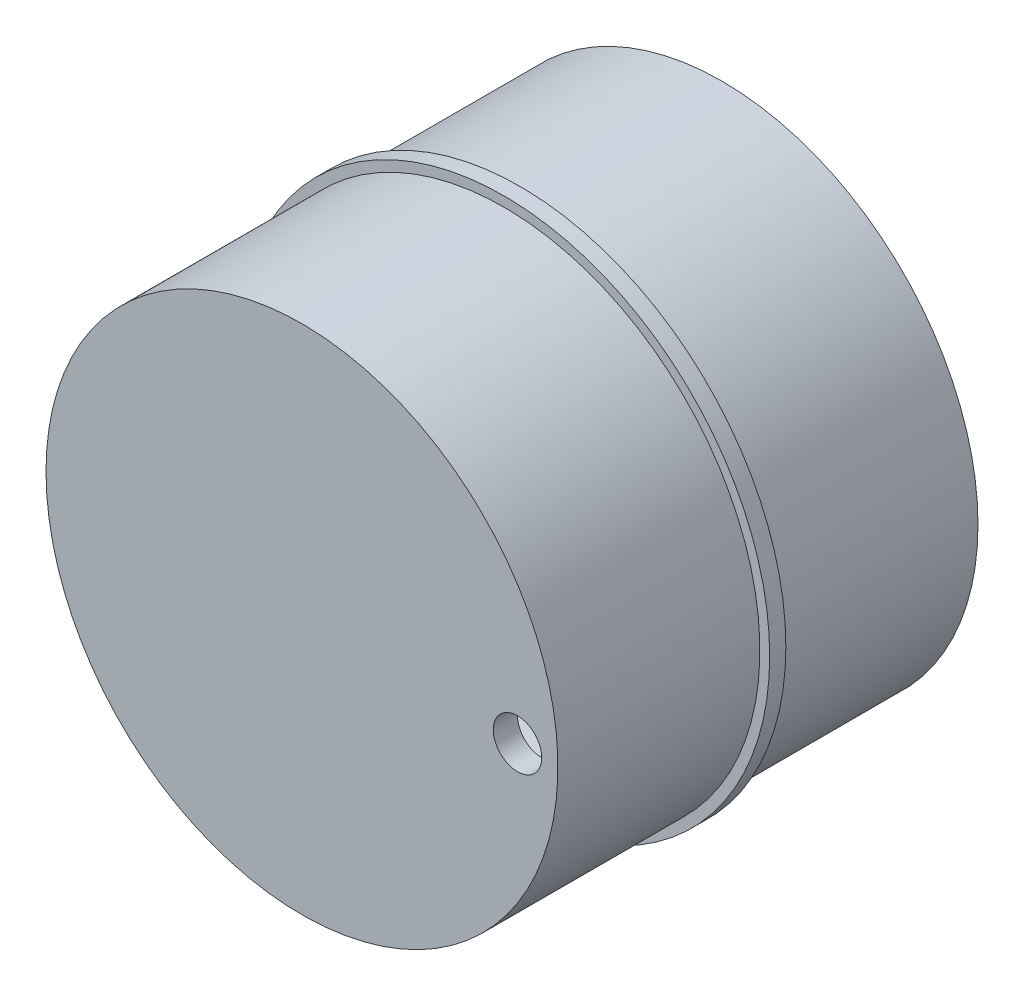
ISO-10303-21;
HEADER;
FILE_DESCRIPTION(('STEP AP214'),'2;1');
FILE_NAME('part.step','',(''),(''),'','','');
FILE_SCHEMA(('AUTOMOTIVE_DESIGN { 1 0 10303 214 1 1 1 1 }'));
ENDSEC;
DATA;
#1=APPLICATION_CONTEXT('core data for automotive mechanical design processes');
#2=APPLICATION_PROTOCOL_DEFINITION('international standard','automotive_design',2000,#1);
#3=PRODUCT_CONTEXT('',#1,'mechanical');
#4=PRODUCT('Part','Part','',(#3));
#5=PRODUCT_RELATED_PRODUCT_CATEGORY('part','',(#4));
#6=PRODUCT_DEFINITION_FORMATION('','',#4);
#7=PRODUCT_DEFINITION_CONTEXT('part definition',#1,'design');
#8=PRODUCT_DEFINITION('design','',#6,#7);
#9=PRODUCT_DEFINITION_SHAPE('','',#8);
#10=(LENGTH_UNIT() NAMED_UNIT(*) SI_UNIT(.MILLI.,.METRE.));
#11=(NAMED_UNIT(*) PLANE_ANGLE_UNIT() SI_UNIT($,.RADIAN.));
#12=(NAMED_UNIT(*) SI_UNIT($,.STERADIAN.) SOLID_ANGLE_UNIT());
#13=UNCERTAINTY_MEASURE_WITH_UNIT(LENGTH_MEASURE(1.E-05),#10,'distance_accuracy_value','');
#14=(GEOMETRIC_REPRESENTATION_CONTEXT(3) GLOBAL_UNCERTAINTY_ASSIGNED_CONTEXT((#13)) GLOBAL_UNIT_ASSIGNED_CONTEXT((#10,
#11,#12)) REPRESENTATION_CONTEXT('',''));
#15=CARTESIAN_POINT('',(0.,0.,0.));
#16=DIRECTION('',(0.,0.,1.));
#17=DIRECTION('',(1.,0.,0.));
#18=AXIS2_PLACEMENT_3D('',#15,#16,#17);
#19=CARTESIAN_POINT('',(0.,0.,26.));
#20=DIRECTION('',(0.,0.,-1.));
#21=DIRECTION('',(-1.,0.,0.));
#22=AXIS2_PLACEMENT_3D('',#19,#20,#21);
#23=CYLINDRICAL_SURFACE('',#22,29.685);
#24=CARTESIAN_POINT('',(0.,0.,-24.));
#25=DIRECTION('',(0.,0.,1.));
#26=DIRECTION('',(1.,0.,0.));
#27=AXIS2_PLACEMENT_3D('',#24,#25,#26);
#28=CIRCLE('',#27,29.685);
#29=CARTESIAN_POINT('',(29.685,0.,-24.));
#30=VERTEX_POINT('',#29);
#31=EDGE_CURVE('E48',#30,#30,#28,.F.);
#32=ORIENTED_EDGE('',*,*,#31,.T.);
#33=EDGE_LOOP('',(#32));
#34=FACE_BOUND('',#33,.T.);
#35=CARTESIAN_POINT('',(29.453969537057,-3.69633649849684,21.0730076943461));
#36=CARTESIAN_POINT('',(29.5229392700678,-3.14675655199982,23.193965750302));
#37=CARTESIAN_POINT('',(27.3507169139899,-2.92520443566389,23.));
#38=CARTESIAN_POINT('',(29.4695717528673,-3.57224783006701,21.042455111234));
#39=CARTESIAN_POINT('',(29.5205826106953,-3.14657390087494,23.1578681699926));
#40=CARTESIAN_POINT('',(27.3837056706705,-2.91761885504985,23.));
#41=CARTESIAN_POINT('',(29.4846512945967,-3.44551478342881,21.0216481388088));
#42=CARTESIAN_POINT('',(29.5199609112697,-3.13905360424794,23.1180814910689));
#43=CARTESIAN_POINT('',(27.4196863234798,-2.90891495812056,23.));
#44=CARTESIAN_POINT('',(29.5133284281869,-3.19039451794967,20.9989874823953));
#45=CARTESIAN_POINT('',(29.5218572889417,-3.10725035716894,23.0355135884787));
#46=CARTESIAN_POINT('',(27.4986435155833,-2.8878663753083,23.));
#47=CARTESIAN_POINT('',(29.5269311746504,-3.06201492466677,20.9970656306401));
#48=CARTESIAN_POINT('',(29.5243001985303,-3.08339422801461,22.9928991113845));
#49=CARTESIAN_POINT('',(27.5415943240499,-2.87553494956119,23.));
#50=CARTESIAN_POINT('',(29.5531535138343,-2.79806859462038,21.0118871211079));
#51=CARTESIAN_POINT('',(29.5320485476803,-3.01585794925101,22.9055103637982));
#52=CARTESIAN_POINT('',(27.638753504253,-2.84483640287777,23.));
#53=CARTESIAN_POINT('',(29.5656535585365,-2.66257081859773,21.0298392096289));
#54=CARTESIAN_POINT('',(29.5374573576492,-2.97148899039025,22.8608171563369));
#55=CARTESIAN_POINT('',(27.6935083481125,-2.82613202304417,23.));
#56=CARTESIAN_POINT('',(29.5884644320832,-2.39581081130452,21.0848958316496));
#57=CARTESIAN_POINT('',(29.5503446439766,-2.86188730247467,22.7763696584035));
#58=CARTESIAN_POINT('',(27.8140102273393,-2.7802049658591,23.));
#59=CARTESIAN_POINT('',(29.598772919087,-2.26455323670954,21.1220207089128));
#60=CARTESIAN_POINT('',(29.5577538578129,-2.79732120062838,22.7366292535912));
#61=CARTESIAN_POINT('',(27.8797688883795,-2.75297325247506,23.));
#62=CARTESIAN_POINT('',(29.6130424859975,-2.06685662812519,21.1926681751423));
#63=CARTESIAN_POINT('',(29.5701138737769,-2.68076175453047,22.6820314595268));
#64=CARTESIAN_POINT('',(27.9909740784887,-2.70116428411568,23.));
#65=CARTESIAN_POINT('',(29.6177664973162,-1.99793663142989,21.220233920248));
#66=CARTESIAN_POINT('',(29.5746069554554,-2.6368635376191,22.6642020636993));
#67=CARTESIAN_POINT('',(28.0321665193155,-2.68095099448803,23.));
#68=CARTESIAN_POINT('',(29.6265947067415,-1.86244748444681,21.280103005163));
#69=CARTESIAN_POINT('',(29.5837434498484,-2.5431389934535,22.6319808348061));
#70=CARTESIAN_POINT('',(28.1183492275346,-2.6358837953534,23.));
#71=CARTESIAN_POINT('',(29.6306988709957,-1.79587846270731,21.312406603536));
#72=CARTESIAN_POINT('',(29.5883800195555,-2.49345097845629,22.6175515151894));
#73=CARTESIAN_POINT('',(28.1633397021439,-2.6110296325552,23.));
#74=CARTESIAN_POINT('',(29.6383205171549,-1.66536997735267,21.3813148936457));
#75=CARTESIAN_POINT('',(29.5976497151315,-2.38843809834289,22.5927304467358));
#76=CARTESIAN_POINT('',(28.2570652075544,-2.5556936896706,23.));
#77=CARTESIAN_POINT('',(29.6418382619637,-1.60142934511592,21.4179176453698));
#78=CARTESIAN_POINT('',(29.6022786034926,-2.33325530151748,22.582283284738));
#79=CARTESIAN_POINT('',(28.3057985459612,-2.52521444440798,23.));
#80=CARTESIAN_POINT('',(29.6483351237785,-1.47627107705529,21.4950062933113));
#81=CARTESIAN_POINT('',(29.6113992004423,-2.21758405950222,22.5659109167429));
#82=CARTESIAN_POINT('',(28.4067976515099,-2.45746060629176,23.));
#83=CARTESIAN_POINT('',(29.6513142091812,-1.41505360115885,21.5354924171546));
#84=CARTESIAN_POINT('',(29.6158896624329,-2.15722770372803,22.5599173811097));
#85=CARTESIAN_POINT('',(28.4590636256659,-2.42018561498649,23.));
#86=CARTESIAN_POINT('',(29.6564334620038,-1.30303846152774,21.6145102476505));
#87=CARTESIAN_POINT('',(29.6240664928161,-2.03956267983707,22.5532630062374));
#88=CARTESIAN_POINT('',(28.5597072143441,-2.34285411877155,23.));
#89=CARTESIAN_POINT('',(29.6586321788916,-1.25190850905339,21.6526312659524));
#90=CARTESIAN_POINT('',(29.6277759049516,-1.98304343273738,22.5519680981928));
#91=CARTESIAN_POINT('',(28.6077290013196,-2.30376073833534,23.));
#92=CARTESIAN_POINT('',(29.6626914621364,-1.15172654572012,21.7312030077597));
#93=CARTESIAN_POINT('',(29.6349360385304,-1.86666988893333,22.5532271240883));
#94=CARTESIAN_POINT('',(28.7054344205754,-2.21856855400212,23.));
#95=CARTESIAN_POINT('',(29.6645519761297,-1.10267485753832,21.7716540907537));
#96=CARTESIAN_POINT('',(29.638389789997,-1.80687575580797,22.5557250780581));
#97=CARTESIAN_POINT('',(28.7551183087907,-2.17246866731539,23.));
#98=CARTESIAN_POINT('',(29.6679689557636,-1.00655719886465,21.8546160996372));
#99=CARTESIAN_POINT('',(29.644987204302,-1.68431008998295,22.564604933006));
#100=CARTESIAN_POINT('',(28.8552792765414,-2.07241393618785,23.));
#101=CARTESIAN_POINT('',(29.669525236535,-0.959492449282768,21.8971282584956));
#102=CARTESIAN_POINT('',(29.6481354099169,-1.62157503795497,22.5709334480841));
#103=CARTESIAN_POINT('',(28.9057568183442,-2.01845435028241,23.));
#104=CARTESIAN_POINT('',(29.672364434785,-0.867261567238716,21.9839067108727));
#105=CARTESIAN_POINT('',(29.6540787972586,-1.49357303590975,22.5873878405427));
#106=CARTESIAN_POINT('',(29.006266061795,-1.90200839747366,23.));
#107=CARTESIAN_POINT('',(29.6736473628078,-0.822095361597305,22.028172936653));
#108=CARTESIAN_POINT('',(29.6568800360234,-1.42831694681504,22.5974639134312));
#109=CARTESIAN_POINT('',(29.0562977805684,-1.83952235961676,23.));
#110=CARTESIAN_POINT('',(29.67597275951,-0.733376062804029,22.1183121246014));
#111=CARTESIAN_POINT('',(29.6621074427791,-1.29551313585051,22.6212330712191));
#112=CARTESIAN_POINT('',(29.1545262838625,-1.70539264692542,23.));
#113=CARTESIAN_POINT('',(29.6770145654228,-0.68982768565854,22.1641891253177));
#114=CARTESIAN_POINT('',(29.6645396770828,-1.22793467005463,22.6348981879123));
#115=CARTESIAN_POINT('',(29.2027177138018,-1.63372455321324,23.));
#116=CARTESIAN_POINT('',(29.6788799430094,-0.604269336932527,22.2571749730407));
#117=CARTESIAN_POINT('',(29.6690005013195,-1.09107218663939,22.6654961259292));
#118=CARTESIAN_POINT('',(29.2953091080832,-1.48129405248241,23.));
#119=CARTESIAN_POINT('',(29.6797035113215,-0.562259389057998,22.3042838390103));
#120=CARTESIAN_POINT('',(29.6710365032522,-1.02172845966825,22.6824079420012));
#121=CARTESIAN_POINT('',(29.339709014015,-1.40053150540341,23.));
#122=CARTESIAN_POINT('',(29.6811550850932,-0.479549948851121,22.3994731960801));
#123=CARTESIAN_POINT('',(29.6746929849381,-0.881758664985384,22.7190422964511));
#124=CARTESIAN_POINT('',(29.4227230305448,-1.23037644579445,23.));
#125=CARTESIAN_POINT('',(29.6817831341938,-0.438850165902445,22.4475534678011));
#126=CARTESIAN_POINT('',(29.6763207574181,-0.811035362955835,22.7387640865103));
#127=CARTESIAN_POINT('',(29.4613384312823,-1.14098586494211,23.));
#128=CARTESIAN_POINT('',(29.6828625368063,-0.358485620701307,22.5444586092211));
#129=CARTESIAN_POINT('',(29.6791558990851,-0.668674967542147,22.7804696361572));
#130=CARTESIAN_POINT('',(29.5308053907974,-0.954604468150846,23.));
#131=CARTESIAN_POINT('',(29.6833138923945,-0.318820846290988,22.593283470163));
#132=CARTESIAN_POINT('',(29.6803696471459,-0.596904142807643,22.8024756790611));
#133=CARTESIAN_POINT('',(29.5616570408096,-0.857613741541609,23.));
#134=CARTESIAN_POINT('',(29.683902257893,-0.256337336398953,22.6713395217971));
#135=CARTESIAN_POINT('',(29.6819666897835,-0.482182649062376,22.8388108560275));
#136=CARTESIAN_POINT('',(29.6031474901909,-0.698670618629292,23.));
#137=CARTESIAN_POINT('',(29.6840922908404,-0.23327538004457,22.7004018651535));
#138=CARTESIAN_POINT('',(29.6824866763772,-0.439514147662455,22.8525752252461));
#139=CARTESIAN_POINT('',(29.6168886900754,-0.638645314309743,23.));
#140=CARTESIAN_POINT('',(29.6844176570562,-0.187351017765726,22.7586599082789));
#141=CARTESIAN_POINT('',(29.6833807201375,-0.354032242761675,22.8805352935781));
#142=CARTESIAN_POINT('',(29.640769703198,-0.516983797238154,23.));
#143=CARTESIAN_POINT('',(29.6845529948504,-0.164488595484086,22.7878555968122));
#144=CARTESIAN_POINT('',(29.6837555900819,-0.311182271628054,22.8947418329877));
#145=CARTESIAN_POINT('',(29.650909814399,-0.455347718218853,23.));
#146=CARTESIAN_POINT('',(29.6848792865771,-0.0961479727651823,22.875521716882));
#147=CARTESIAN_POINT('',(29.6846597207476,-0.18271240410829,22.9377290214179));
#148=CARTESIAN_POINT('',(29.6755476386697,-0.26886486865931,23.));
#149=CARTESIAN_POINT('',(29.684990942448,-0.0508709317983721,22.9341285104842));
#150=CARTESIAN_POINT('',(29.6849745669356,-0.0966062436314608,22.9670630048246));
#151=CARTESIAN_POINT('',(29.6842942040959,-0.14232527764074,23.));
#152=CARTESIAN_POINT('',(29.684999822859,-0.00373661662785953,22.995161481673));
#153=CARTESIAN_POINT('',(29.6849995080726,-0.00709561682999533,22.9975807304717));
#154=CARTESIAN_POINT('',(29.6849864531754,-0.0104546029644848,23.));
#155=CARTESIAN_POINT('',(29.6849999991784,-0.00186830794603105,22.9975807410863));
#156=CARTESIAN_POINT('',(29.6850000016923,-0.00354779290526891,22.998790363653));
#157=CARTESIAN_POINT('',(29.6850001249004,-0.00522728704639961,23.));
#158=CARTESIAN_POINT('',(29.685,0.,23.));
#159=CARTESIAN_POINT('',(29.685,2.72241405150234E-08,23.));
#160=CARTESIAN_POINT('',(29.685,5.44482810300468E-08,23.));
#161=(BOUNDED_SURFACE() B_SPLINE_SURFACE(3,2,((#35,#36,#37),(#38,#39,#40),(#41,#42,#43),(#44,
#45,#46),(#47,#48,#49),(#50,#51,#52),(#53,#54,#55),(#56,#57,#58),(#59,#60,#61),(#62,#63,#64),
(#65,#66,#67),(#68,#69,#70),(#71,#72,#73),(#74,#75,#76),(#77,#78,#79),(#80,#81,#82),(#83,#84,
#85),(#86,#87,#88),(#89,#90,#91),(#92,#93,#94),(#95,#96,#97),(#98,#99,#100),(#101,#102,#103),
(#104,#105,#106),(#107,#108,#109),(#110,#111,#112),(#113,#114,#115),(#116,#117,#118),(#119,#120,
#121),(#122,#123,#124),(#125,#126,#127),(#128,#129,#130),(#131,#132,#133),(#134,#135,#136),
(#137,#138,#139),(#140,#141,#142),(#143,#144,#145),(#146,#147,#148),(#149,#150,#151),(#152,#153,
#154),(#155,#156,#157),(#158,#159,#160)),.UNSPECIFIED.,.F.,.F.,
.F.) B_SPLINE_SURFACE_WITH_KNOTS((4,2,2,2,2,2,2,2,2,2,2,2,2,2,2,2,2,2,2,2,4),(3,3),(0.,
0.361081568538373,0.720859295513028,1.10378268553387,1.48711322327682,1.69717429873617,
1.90724684233589,2.11722495133578,2.32721537584145,2.51038880958023,2.69359057989006,
2.87690333029894,3.06020900843962,3.24401270431783,3.42781923127684,3.61158470195191,
3.79534801303014,3.90381520162624,4.01227341328839,4.22897594531716,4.2379202172408),(0.,1.),
.UNSPECIFIED.) GEOMETRIC_REPRESENTATION_ITEM() RATIONAL_B_SPLINE_SURFACE(((1.,0.673998534827001,
1.),(1.,0.680289928360832,1.),(1.,0.686911742011523,1.),(1.,0.700914381981028,1.),(1.,
0.708292381214728,1.),(1.,0.724452859527103,1.),(1.,0.733295157529229,1.),(1.,0.752192426877243,
1.),(1.,0.762248677615647,1.),(1.,0.778826443155952,1.),(1.,0.784891067513485,1.),(1.,
0.797417966880452,1.),(1.,0.803880263581275,1.),(1.,0.817177906274684,1.),(1.,0.824013083263296,
1.),(1.,0.838009947839924,1.),(1.,0.845171654554724,1.),(1.,0.858801285198915,1.),(1.,
0.865241010600349,1.),(1.,0.878212891758965,1.),(1.,0.88474506166083,1.),(1.,0.897786402088374,
1.),(1.,0.904295556284363,1.),(1.,0.917136776856061,1.),(1.,0.92346885005419,1.),(1.,
0.935794111618746,1.),(1.,0.941786332539605,1.),(1.,0.953210638277745,1.),(1.,0.958642714465972,
1.),(1.,0.968732531765465,1.),(1.,0.973390445566492,1.),(1.,0.98172684395136,1.),(1.,
0.98540534004473,1.),(1.,0.990334930860917,1.),(1.,0.991963054820812,1.),(1.,0.994787885445139,
1.),(1.,0.995984627803268,1.),(1.,0.998889860818611,1.),(1.,0.999917063749642,1.),(1.,
0.999998404885635,1.),(1.,1.00000001227378,1.),(1.,1.,1.))) REPRESENTATION_ITEM('') SURFACE());
#162=CARTESIAN_POINT('',(29.453969537057,-3.69633649849684,21.0730076943461));
#163=CARTESIAN_POINT('',(29.4695717528673,-3.57224783006701,21.042455111234));
#164=CARTESIAN_POINT('',(29.4846512945967,-3.44551478342881,21.0216481388088));
#165=CARTESIAN_POINT('',(29.5133284281869,-3.19039451794967,20.9989874823953));
#166=CARTESIAN_POINT('',(29.5269311746504,-3.06201492466677,20.9970656306401));
#167=CARTESIAN_POINT('',(29.5531535138343,-2.79806859462038,21.0118871211079));
#168=CARTESIAN_POINT('',(29.5656535585365,-2.66257081859773,21.0298392096289));
#169=CARTESIAN_POINT('',(29.5884644320832,-2.39581081130452,21.0848958316496));
#170=CARTESIAN_POINT('',(29.598772919087,-2.26455323670954,21.1220207089128));
#171=CARTESIAN_POINT('',(29.6130424859975,-2.06685662812519,21.1926681751423));
#172=CARTESIAN_POINT('',(29.6177664973162,-1.99793663142989,21.220233920248));
#173=CARTESIAN_POINT('',(29.6265947067415,-1.86244748444681,21.280103005163));
#174=CARTESIAN_POINT('',(29.6306988709957,-1.79587846270731,21.312406603536));
#175=CARTESIAN_POINT('',(29.6383205171549,-1.66536997735267,21.3813148936457));
#176=CARTESIAN_POINT('',(29.6418382619637,-1.60142934511592,21.4179176453698));
#177=CARTESIAN_POINT('',(29.6483351237785,-1.47627107705529,21.4950062933113));
#178=CARTESIAN_POINT('',(29.6513142091812,-1.41505360115885,21.5354924171546));
#179=CARTESIAN_POINT('',(29.6564334620038,-1.30303846152774,21.6145102476505));
#180=CARTESIAN_POINT('',(29.6586321788916,-1.25190850905339,21.6526312659524));
#181=CARTESIAN_POINT('',(29.6626914621364,-1.15172654572012,21.7312030077597));
#182=CARTESIAN_POINT('',(29.6645519761297,-1.10267485753832,21.7716540907537));
#183=CARTESIAN_POINT('',(29.6679689557636,-1.00655719886465,21.8546160996372));
#184=CARTESIAN_POINT('',(29.669525236535,-0.959492449282768,21.8971282584956));
#185=CARTESIAN_POINT('',(29.672364434785,-0.867261567238717,21.9839067108727));
#186=CARTESIAN_POINT('',(29.6736473628078,-0.822095361597305,22.028172936653));
#187=CARTESIAN_POINT('',(29.67597275951,-0.733376062804029,22.1183121246014));
#188=CARTESIAN_POINT('',(29.6770145654228,-0.68982768565854,22.1641891253177));
#189=CARTESIAN_POINT('',(29.6788799430094,-0.604269336932527,22.2571749730407));
#190=CARTESIAN_POINT('',(29.6797035113215,-0.562259389057998,22.3042838390103));
#191=CARTESIAN_POINT('',(29.6811550850932,-0.479549948851121,22.3994731960801));
#192=CARTESIAN_POINT('',(29.6817831341938,-0.438850165902445,22.4475534678011));
#193=CARTESIAN_POINT('',(29.6828625368063,-0.358485620701307,22.5444586092211));
#194=CARTESIAN_POINT('',(29.6833138923945,-0.318820846290988,22.593283470163));
#195=CARTESIAN_POINT('',(29.683902257893,-0.256337336398953,22.6713395217971));
#196=CARTESIAN_POINT('',(29.6840922908404,-0.23327538004457,22.7004018651535));
#197=CARTESIAN_POINT('',(29.6844176570562,-0.187351017765726,22.7586599082789));
#198=CARTESIAN_POINT('',(29.6845529948504,-0.164488595484086,22.7878555968122));
#199=CARTESIAN_POINT('',(29.6848792865771,-0.0961479727651825,22.875521716882));
#200=CARTESIAN_POINT('',(29.684990942448,-0.0508709317983734,22.9341285104842));
#201=CARTESIAN_POINT('',(29.684999822859,-0.00373661662785953,22.995161481673));
#202=CARTESIAN_POINT('',(29.6849999991784,-0.00186830794603105,22.9975807410863));
#203=CARTESIAN_POINT('',(29.685,0.,23.));
#204=B_SPLINE_CURVE_WITH_KNOTS('',3,(#162,#163,#164,#165,#166,#167,#168,#169,#170,#171,#172,
#173,#174,#175,#176,#177,#178,#179,#180,#181,#182,#183,#184,#185,#186,#187,#188,#189,#190,#191,
#192,#193,#194,#195,#196,#197,#198,#199,#200,#201,#202,#203),.UNSPECIFIED.,.F.,.F.,(4,2,2,2,2,2,
2,2,2,2,2,2,2,2,2,2,2,2,2,2,4),(0.,0.361081568538373,0.720859295513028,1.10378268553387,
1.48711322327682,1.69717429873617,1.90724684233589,2.11722495133578,2.32721537584145,
2.51038880958023,2.69359057989006,2.87690333029894,3.06020900843962,3.24401270431783,
3.42781923127684,3.61158470195191,3.79534801303014,3.90381520162624,4.01227341328839,
4.22897594531716,4.2379202172408),.UNSPECIFIED.);
#205=CARTESIAN_POINT('',(29.5242743060304,-3.08487466556988,21.));
#206=VERTEX_POINT('',#205);
#207=CARTESIAN_POINT('',(29.685,0.,23.));
#208=VERTEX_POINT('',#207);
#209=EDGE_CURVE('E72',#206,#208,#204,.T.);
#210=ORIENTED_EDGE('',*,*,#209,.T.);
#211=CARTESIAN_POINT('',(27.3507168698051,2.92520444571947,23.));
#212=CARTESIAN_POINT('',(29.5229392695628,3.14675655602347,23.1939658000127));
#213=CARTESIAN_POINT('',(29.453969537057,3.69633649849684,21.0730076943461));
#214=CARTESIAN_POINT('',(27.3837056547894,2.91761885866434,23.));
#215=CARTESIAN_POINT('',(29.5205826105056,3.14657390230856,23.1578681875387));
#216=CARTESIAN_POINT('',(29.4695717528669,3.57224783007004,21.0424551112298));
#217=CARTESIAN_POINT('',(27.4196863192201,2.90891495909017,23.));
#218=CARTESIAN_POINT('',(29.5199609112185,3.13905360462151,23.1180814956814));
#219=CARTESIAN_POINT('',(29.4846512945961,3.44551478343463,21.0216481388044));
#220=CARTESIAN_POINT('',(27.4986435198211,2.88786637434392,23.));
#221=CARTESIAN_POINT('',(29.5218572889893,3.10725035684167,23.0355135840618));
#222=CARTESIAN_POINT('',(29.5133284281863,3.19039451795542,20.9989874823921));
#223=CARTESIAN_POINT('',(27.5415943252172,2.87553494929546,23.));
#224=CARTESIAN_POINT('',(29.5243001985426,3.08339422793224,22.9928991101933));
#225=CARTESIAN_POINT('',(29.5269311746501,3.06201492466961,20.997065630639));
#226=CARTESIAN_POINT('',(27.6387535030096,2.84483640316093,23.));
#227=CARTESIAN_POINT('',(29.5320485476699,3.01585794931674,22.9055103650119));
#228=CARTESIAN_POINT('',(29.5531535138343,2.79806859462034,21.0118871211089));
#229=CARTESIAN_POINT('',(27.6935083477816,2.82613202312019,23.));
#230=CARTESIAN_POINT('',(29.5374573576467,2.97148899040633,22.8608171566516));
#231=CARTESIAN_POINT('',(29.5656535585365,2.66257081859772,21.0298392096291));
#232=CARTESIAN_POINT('',(27.8140102276628,2.78020496578596,23.));
#233=CARTESIAN_POINT('',(29.5503446439776,2.86188730247202,22.7763696581088));
#234=CARTESIAN_POINT('',(29.5884644320832,2.39581081130453,21.0848958316494));
#235=CARTESIAN_POINT('',(27.8797688884436,2.75297325246019,23.));
#236=CARTESIAN_POINT('',(29.5577538578131,2.79732120062776,22.7366292535347));
#237=CARTESIAN_POINT('',(29.598772919087,2.26455323670955,21.1220207089128));
#238=CARTESIAN_POINT('',(27.9909740784531,2.70116428412408,23.));
#239=CARTESIAN_POINT('',(29.5701138737769,2.68076175453022,22.6820314595571));
#240=CARTESIAN_POINT('',(29.6130424859975,2.06685662812516,21.1926681751423));
#241=CARTESIAN_POINT('',(28.0321665193032,2.68095099449167,23.));
#242=CARTESIAN_POINT('',(29.5746069554552,2.63686353762091,22.6642020637089));
#243=CARTESIAN_POINT('',(29.6177664973162,1.99793663142983,21.220233920248));
#244=CARTESIAN_POINT('',(28.11834922754,2.63588379535337,23.));
#245=CARTESIAN_POINT('',(29.5837434498481,2.54313899345683,22.6319808348004));
#246=CARTESIAN_POINT('',(29.6265947067415,1.86244748444676,21.2801030051631));
#247=CARTESIAN_POINT('',(28.1633397021438,2.61102963255627,23.));
#248=CARTESIAN_POINT('',(29.5883800195554,2.49345097845854,22.6175515151885));
#249=CARTESIAN_POINT('',(29.6306988709957,1.79587846270728,21.312406603536));
#250=CARTESIAN_POINT('',(28.2570652075545,2.55569368966956,23.));
#251=CARTESIAN_POINT('',(29.5976497151316,2.38843809834071,22.5927304467367));
#252=CARTESIAN_POINT('',(29.6383205171549,1.66536997735273,21.3813148936456));
#253=CARTESIAN_POINT('',(28.3057985459671,2.52521444440376,23.));
#254=CARTESIAN_POINT('',(29.6022786034928,2.33325530151224,22.5822832847359));
#255=CARTESIAN_POINT('',(29.6418382619637,1.60142934511604,21.4179176453697));
#256=CARTESIAN_POINT('',(28.4067976515167,2.45746060628749,23.));
#257=CARTESIAN_POINT('',(29.6113992004425,2.21758405949767,22.56591091674));
#258=CARTESIAN_POINT('',(29.6483351237785,1.4762710770554,21.4950062933112));
#259=CARTESIAN_POINT('',(28.4590636256677,2.42018561498534,23.));
#260=CARTESIAN_POINT('',(29.615889662433,2.15722770372687,22.5599173811088));
#261=CARTESIAN_POINT('',(29.6513142091812,1.4150536011589,21.5354924171546));
#262=CARTESIAN_POINT('',(28.55970721435,2.3428541187668,23.));
#263=CARTESIAN_POINT('',(29.6240664928164,2.03956267983175,22.553263006236));
#264=CARTESIAN_POINT('',(29.6564334620038,1.30303846152657,21.6145102476513));
#265=CARTESIAN_POINT('',(28.6077290013329,2.30376073832485,23.));
#266=CARTESIAN_POINT('',(29.6277759049521,1.98304343272592,22.5519680981897));
#267=CARTESIAN_POINT('',(29.6586321788917,1.25190850905109,21.6526312659541));
#268=CARTESIAN_POINT('',(28.7054344205821,2.2185685539952,23.));
#269=CARTESIAN_POINT('',(29.6349360385308,1.86666988892576,22.5532271240878));
#270=CARTESIAN_POINT('',(29.6626914621366,1.15172654571566,21.7312030077633));
#271=CARTESIAN_POINT('',(28.7551183087832,2.17246866731778,23.));
#272=CARTESIAN_POINT('',(29.6383897899969,1.80687575580979,22.555725078062));
#273=CARTESIAN_POINT('',(29.6645519761299,1.10267485753281,21.7716540907582));
#274=CARTESIAN_POINT('',(28.8552792765303,2.07241393620406,23.));
#275=CARTESIAN_POINT('',(29.644987204302,1.68431008999221,22.5646049330105));
#276=CARTESIAN_POINT('',(29.6679689557639,1.00655719885736,21.8546160996437));
#277=CARTESIAN_POINT('',(28.9057568183437,2.01845435030316,23.));
#278=CARTESIAN_POINT('',(29.6481354099172,1.62157503796294,22.5709334480849));
#279=CARTESIAN_POINT('',(29.6695252365352,0.95949244927474,21.897128258503));
#280=CARTESIAN_POINT('',(29.0062660618339,1.90200839740844,23.));
#281=CARTESIAN_POINT('',(29.6540787972599,1.4935730358608,22.5873878405415));
#282=CARTESIAN_POINT('',(29.6723644347853,0.867261567229271,21.9839067108818));
#283=CARTESIAN_POINT('',(29.0562977806362,1.83952235946105,23.));
#284=CARTESIAN_POINT('',(29.6568800360254,1.42831694671148,22.5974639134314));
#285=CARTESIAN_POINT('',(29.6736473628081,0.822095361587184,22.028172936663));
#286=CARTESIAN_POINT('',(29.1545262838232,1.70539264704241,23.));
#287=CARTESIAN_POINT('',(29.6621074427785,1.29551313591615,22.6212330712232));
#288=CARTESIAN_POINT('',(29.6759727595102,0.733376062794452,22.1183121246114));
#289=CARTESIAN_POINT('',(29.2027177136259,1.63372455369501,23.));
#290=CARTESIAN_POINT('',(29.6645396770792,1.22793467033857,22.6348981879191));
#291=CARTESIAN_POINT('',(29.677014565423,0.689827685650114,22.1641891253268));
#292=CARTESIAN_POINT('',(29.2953091082782,1.48129405196932,23.));
#293=CARTESIAN_POINT('',(29.6690005013238,1.09107218633536,22.6654961259267));
#294=CARTESIAN_POINT('',(29.6788799430095,0.604269336926094,22.2571749730477));
#295=CARTESIAN_POINT('',(29.3397090147173,1.40053150353063,23.));
#296=CARTESIAN_POINT('',(29.6710365032671,1.02172845858109,22.6824079419841));
#297=CARTESIAN_POINT('',(29.6797035113216,0.562259389052408,22.3042838390163));
#298=CARTESIAN_POINT('',(29.4227230298343,1.23037644768381,23.));
#299=CARTESIAN_POINT('',(29.6746929849237,0.881758666054477,22.7190422964768));
#300=CARTESIAN_POINT('',(29.6811550850932,0.47954994884766,22.3994731960845));
#301=CARTESIAN_POINT('',(29.4613384286523,1.14098587195181,23.));
#302=CARTESIAN_POINT('',(29.6763207573656,0.811035366883814,22.7387640866042));
#303=CARTESIAN_POINT('',(29.6817831341939,0.438850165900275,22.4475534678051));
#304=CARTESIAN_POINT('',(29.5308053934373,0.954604461114831,23.));
#305=CARTESIAN_POINT('',(29.6791558991366,0.668674963677395,22.7804696360523));
#306=CARTESIAN_POINT('',(29.6828625368063,0.358485620699105,22.5444586092224));
#307=CARTESIAN_POINT('',(29.5616570506389,0.857613715339843,23.));
#308=CARTESIAN_POINT('',(29.6803696473352,0.596904128559127,22.8024756786435));
#309=CARTESIAN_POINT('',(29.6833138923945,0.31882084628746,22.593283470162));
#310=CARTESIAN_POINT('',(29.6031474964916,0.698670587728476,23.));
#311=CARTESIAN_POINT('',(29.6819666899029,0.482182632944847,22.8388108557326));
#312=CARTESIAN_POINT('',(29.683902257893,0.256337336402617,22.6713395217957));
#313=CARTESIAN_POINT('',(29.6168886917882,0.638645287314457,23.));
#314=CARTESIAN_POINT('',(29.6824866764095,0.439514133928243,22.8525752251624));
#315=CARTESIAN_POINT('',(29.6840922908403,0.233275380053576,22.7004018651518));
#316=CARTESIAN_POINT('',(29.640769701474,0.516983824289002,23.));
#317=CARTESIAN_POINT('',(29.6833807201052,0.354032256473475,22.8805352936603));
#318=CARTESIAN_POINT('',(29.6844176570562,0.187351017768752,22.7586599082654));
#319=CARTESIAN_POINT('',(29.6509098138258,0.45534779540648,23.));
#320=CARTESIAN_POINT('',(29.6837555900713,0.31118231040816,22.8947418330058));
#321=CARTESIAN_POINT('',(29.6845529948504,0.164488595475792,22.787855596787));
#322=CARTESIAN_POINT('',(29.6755476398373,0.268864714268151,23.));
#323=CARTESIAN_POINT('',(29.6846597207694,0.182712326763225,22.9377290213346));
#324=CARTESIAN_POINT('',(29.6848792865773,0.0961479727428064,22.875521716851));
#325=CARTESIAN_POINT('',(29.6842942041422,0.142324460418009,23.));
#326=CARTESIAN_POINT('',(29.6849745669364,0.0966058349860127,22.9670630048187));
#327=CARTESIAN_POINT('',(29.684990942448,0.05087093180118,22.9341285104782));
#328=CARTESIAN_POINT('',(29.6849864531735,0.0104546366953433,23.));
#329=CARTESIAN_POINT('',(29.6849995080726,0.00709563369552121,22.9975807304719));
#330=CARTESIAN_POINT('',(29.684999822859,0.00373661662790876,22.995161481673));
#331=CARTESIAN_POINT('',(29.6850001248984,0.00522735702950453,23.));
#332=CARTESIAN_POINT('',(29.6850000016923,0.00354782789689242,22.9987903636531));
#333=CARTESIAN_POINT('',(29.6849999991784,0.00186830794608179,22.9975807410863));
#334=CARTESIAN_POINT('',(29.685,5.44482810300468E-08,23.));
#335=CARTESIAN_POINT('',(29.685,2.72241405150234E-08,23.));
#336=CARTESIAN_POINT('',(29.685,0.,23.));
#337=(BOUNDED_SURFACE() B_SPLINE_SURFACE(3,2,((#211,#212,#213),(#214,#215,#216),(#217,#218,
#219),(#220,#221,#222),(#223,#224,#225),(#226,#227,#228),(#229,#230,#231),(#232,#233,#234),
(#235,#236,#237),(#238,#239,#240),(#241,#242,#243),(#244,#245,#246),(#247,#248,#249),(#250,#251,
#252),(#253,#254,#255),(#256,#257,#258),(#259,#260,#261),(#262,#263,#264),(#265,#266,#267),
(#268,#269,#270),(#271,#272,#273),(#274,#275,#276),(#277,#278,#279),(#280,#281,#282),(#283,#284,
#285),(#286,#287,#288),(#289,#290,#291),(#292,#293,#294),(#295,#296,#297),(#298,#299,#300),
(#301,#302,#303),(#304,#305,#306),(#307,#308,#309),(#310,#311,#312),(#313,#314,#315),(#316,#317,
#318),(#319,#320,#321),(#322,#323,#324),(#325,#326,#327),(#328,#329,#330),(#331,#332,#333),
(#334,#335,#336)),.UNSPECIFIED.,.F.,.F.,.F.) B_SPLINE_SURFACE_WITH_KNOTS((4,2,2,2,2,2,2,2,2,2,2,
2,2,2,2,2,2,2,2,2,4),(3,3),(0.,0.361081568531184,0.720859295513706,1.10378268553455,
1.4871132232775,1.69717429873693,1.90724684233657,2.11722495133626,2.32721537584213,
2.51038880958502,2.69359057989901,2.87690333031121,3.06020900845513,3.24401270432912,
3.42781923128406,3.61158470195597,3.79534801303083,3.90381520161749,4.01227341327006,
4.22897594531798,4.23792021724161),(0.,1.),
.UNSPECIFIED.) GEOMETRIC_REPRESENTATION_ITEM() RATIONAL_B_SPLINE_SURFACE(((1.,0.673998526928453,
1.),(1.,0.680289925521945,1.),(1.,0.686911741250104,1.),(1.,0.70091438273862,1.),(1.,
0.708292381423387,1.),(1.,0.724452859304845,1.),(1.,0.733295157470154,1.),(1.,0.752192426935121,
1.),(1.,0.762248677627069,1.),(1.,0.778826443149609,1.),(1.,0.784891067511359,1.),(1.,
0.797417966881526,1.),(1.,0.803880263581331,1.),(1.,0.81717790627462,1.),(1.,0.824013083264128,
1.),(1.,0.838009947840929,1.),(1.,0.845171654555008,1.),(1.,0.858801285199721,1.),(1.,
0.865241010602181,1.),(1.,0.878212891759858,1.),(1.,0.884745061659757,1.),(1.,0.897786402086865,
1.),(1.,0.904295556284385,1.),(1.,0.917136776861032,1.),(1.,0.923468850062577,1.),(1.,
0.935794111613963,1.),(1.,0.941786332518196,1.),(1.,0.953210638301512,1.),(1.,0.958642714551543,
1.),(1.,0.968732531678842,1.),(1.,0.973390445245934,1.),(1.,0.981726844273116,1.),(1.,
0.985405341242724,1.),(1.,0.990334931628916,1.),(1.,0.9919630550297,1.),(1.,0.994787885234912,
1.),(1.,0.995984627732981,1.),(1.,0.998889860960203,1.),(1.,0.999917063755255,1.),(1.,
0.999998404885403,1.),(1.,1.00000001227354,1.),(1.,1.,1.))) REPRESENTATION_ITEM('') SURFACE());
#338=CARTESIAN_POINT('',(29.453969537057,3.69633649849684,21.0730076943461));
#339=CARTESIAN_POINT('',(29.4695717528669,3.57224783007004,21.0424551112298));
#340=CARTESIAN_POINT('',(29.4846512945961,3.44551478343463,21.0216481388044));
#341=CARTESIAN_POINT('',(29.5133284281863,3.19039451795542,20.9989874823921));
#342=CARTESIAN_POINT('',(29.5269311746501,3.06201492466961,20.997065630639));
#343=CARTESIAN_POINT('',(29.5531535138343,2.79806859462034,21.0118871211089));
#344=CARTESIAN_POINT('',(29.5656535585365,2.66257081859771,21.0298392096291));
#345=CARTESIAN_POINT('',(29.5884644320832,2.39581081130453,21.0848958316494));
#346=CARTESIAN_POINT('',(29.598772919087,2.26455323670955,21.1220207089128));
#347=CARTESIAN_POINT('',(29.6130424859975,2.06685662812516,21.1926681751423));
#348=CARTESIAN_POINT('',(29.6177664973162,1.99793663142983,21.220233920248));
#349=CARTESIAN_POINT('',(29.6265947067415,1.86244748444676,21.2801030051631));
#350=CARTESIAN_POINT('',(29.6306988709957,1.79587846270728,21.312406603536));
#351=CARTESIAN_POINT('',(29.6383205171549,1.66536997735273,21.3813148936456));
#352=CARTESIAN_POINT('',(29.6418382619637,1.60142934511604,21.4179176453697));
#353=CARTESIAN_POINT('',(29.6483351237785,1.4762710770554,21.4950062933112));
#354=CARTESIAN_POINT('',(29.6513142091812,1.4150536011589,21.5354924171546));
#355=CARTESIAN_POINT('',(29.6564334620038,1.30303846152657,21.6145102476513));
#356=CARTESIAN_POINT('',(29.6586321788917,1.25190850905109,21.6526312659541));
#357=CARTESIAN_POINT('',(29.6626914621366,1.15172654571566,21.7312030077633));
#358=CARTESIAN_POINT('',(29.6645519761299,1.10267485753281,21.7716540907582));
#359=CARTESIAN_POINT('',(29.6679689557639,1.00655719885736,21.8546160996437));
#360=CARTESIAN_POINT('',(29.6695252365352,0.95949244927474,21.897128258503));
#361=CARTESIAN_POINT('',(29.6723644347853,0.867261567229271,21.9839067108818));
#362=CARTESIAN_POINT('',(29.6736473628081,0.822095361587184,22.028172936663));
#363=CARTESIAN_POINT('',(29.6759727595102,0.733376062794452,22.1183121246114));
#364=CARTESIAN_POINT('',(29.677014565423,0.689827685650114,22.1641891253268));
#365=CARTESIAN_POINT('',(29.6788799430095,0.604269336926094,22.2571749730477));
#366=CARTESIAN_POINT('',(29.6797035113216,0.562259389052408,22.3042838390163));
#367=CARTESIAN_POINT('',(29.6811550850932,0.47954994884766,22.3994731960845));
#368=CARTESIAN_POINT('',(29.6817831341939,0.438850165900275,22.4475534678051));
#369=CARTESIAN_POINT('',(29.6828625368063,0.358485620699105,22.5444586092224));
#370=CARTESIAN_POINT('',(29.6833138923945,0.31882084628746,22.593283470162));
#371=CARTESIAN_POINT('',(29.683902257893,0.256337336402617,22.6713395217957));
#372=CARTESIAN_POINT('',(29.6840922908403,0.233275380053576,22.7004018651518));
#373=CARTESIAN_POINT('',(29.6844176570562,0.187351017768752,22.7586599082654));
#374=CARTESIAN_POINT('',(29.6845529948504,0.164488595475792,22.787855596787));
#375=CARTESIAN_POINT('',(29.6848792865773,0.0961479727428065,22.875521716851));
#376=CARTESIAN_POINT('',(29.684990942448,0.0508709318011813,22.9341285104782));
#377=CARTESIAN_POINT('',(29.684999822859,0.00373661662790876,22.995161481673));
#378=CARTESIAN_POINT('',(29.6849999991784,0.0018683079460818,22.9975807410863));
#379=CARTESIAN_POINT('',(29.685,0.,23.));
#380=B_SPLINE_CURVE_WITH_KNOTS('',3,(#338,#339,#340,#341,#342,#343,#344,#345,#346,#347,#348,
#349,#350,#351,#352,#353,#354,#355,#356,#357,#358,#359,#360,#361,#362,#363,#364,#365,#366,#367,
#368,#369,#370,#371,#372,#373,#374,#375,#376,#377,#378,#379),.UNSPECIFIED.,.F.,.F.,(4,2,2,2,2,2,
2,2,2,2,2,2,2,2,2,2,2,2,2,2,4),(0.,0.361081568531184,0.720859295513706,1.10378268553455,
1.4871132232775,1.69717429873693,1.90724684233657,2.11722495133626,2.32721537584213,
2.51038880958502,2.69359057989901,2.87690333031121,3.06020900845513,3.24401270432912,
3.42781923128406,3.61158470195597,3.79534801303083,3.90381520161749,4.01227341327006,
4.22897594531798,4.23792021724161),.UNSPECIFIED.);
#381=CARTESIAN_POINT('',(29.5242743060304,3.08487466556988,21.));
#382=VERTEX_POINT('',#381);
#383=EDGE_CURVE('E74',#208,#382,#380,.F.);
#384=ORIENTED_EDGE('',*,*,#383,.T.);
#385=CARTESIAN_POINT('',(0.,0.,21.));
#386=DIRECTION('',(0.,0.,1.));
#387=DIRECTION('',(1.,0.,0.));
#388=AXIS2_PLACEMENT_3D('',#385,#386,#387);
#389=CIRCLE('',#388,29.685);
#390=EDGE_CURVE('E76',#382,#206,#389,.T.);
#391=ORIENTED_EDGE('',*,*,#390,.T.);
#392=EDGE_LOOP('',(#210,#384,#391));
#393=FACE_BOUND('',#392,.T.);
#394=ADVANCED_FACE('F35',(#34,#393),#23,.F.);
#395=CARTESIAN_POINT('',(0.,0.,26.));
#396=DIRECTION('',(0.,0.,-1.));
#397=DIRECTION('',(-1.,0.,0.));
#398=AXIS2_PLACEMENT_3D('',#395,#396,#397);
#399=CYLINDRICAL_SURFACE('',#398,31.685);
#400=CARTESIAN_POINT('',(0.,0.,-26.));
#401=DIRECTION('',(0.,0.,1.));
#402=DIRECTION('',(1.,0.,0.));
#403=AXIS2_PLACEMENT_3D('',#400,#401,#402);
#404=CIRCLE('',#403,31.685);
#405=CARTESIAN_POINT('',(-31.685,0.,-26.));
#406=VERTEX_POINT('',#405);
#407=EDGE_CURVE('E175',#406,#406,#404,.T.);
#408=CARTESIAN_POINT('',(0.,0.,-1.));
#409=DIRECTION('',(0.,0.,1.));
#410=DIRECTION('',(1.,0.,0.));
#411=AXIS2_PLACEMENT_3D('',#408,#409,#410);
#412=CIRCLE('',#411,31.685);
#413=CARTESIAN_POINT('',(-31.685,0.,-1.));
#414=VERTEX_POINT('',#413);
#415=EDGE_CURVE('E80',#414,#414,#412,.T.);
#416=CARTESIAN_POINT('',(-31.685,0.,-26.));
#417=CARTESIAN_POINT('',(-31.685,0.,-25.7395833333333));
#418=CARTESIAN_POINT('',(-31.685,0.,-25.4791666666667));
#419=CARTESIAN_POINT('',(-31.685,0.,-24.9583333333333));
#420=CARTESIAN_POINT('',(-31.685,0.,-24.6979166666667));
#421=CARTESIAN_POINT('',(-31.685,0.,-24.1770833333333));
#422=CARTESIAN_POINT('',(-31.685,0.,-23.9166666666667));
#423=CARTESIAN_POINT('',(-31.685,0.,-23.3958333333333));
#424=CARTESIAN_POINT('',(-31.685,0.,-23.1354166666667));
#425=CARTESIAN_POINT('',(-31.685,0.,-22.6145833333333));
#426=CARTESIAN_POINT('',(-31.685,0.,-22.3541666666667));
#427=CARTESIAN_POINT('',(-31.685,0.,-21.8333333333333));
#428=CARTESIAN_POINT('',(-31.685,0.,-21.5729166666667));
#429=CARTESIAN_POINT('',(-31.685,0.,-21.0520833333333));
#430=CARTESIAN_POINT('',(-31.685,0.,-20.7916666666667));
#431=CARTESIAN_POINT('',(-31.685,0.,-20.2708333333333));
#432=CARTESIAN_POINT('',(-31.685,0.,-20.0104166666667));
#433=CARTESIAN_POINT('',(-31.685,0.,-19.4895833333333));
#434=CARTESIAN_POINT('',(-31.685,0.,-19.2291666666667));
#435=CARTESIAN_POINT('',(-31.685,0.,-18.7083333333333));
#436=CARTESIAN_POINT('',(-31.685,0.,-18.4479166666667));
#437=CARTESIAN_POINT('',(-31.685,0.,-17.9270833333333));
#438=CARTESIAN_POINT('',(-31.685,0.,-17.6666666666667));
#439=CARTESIAN_POINT('',(-31.685,0.,-17.1458333333333));
#440=CARTESIAN_POINT('',(-31.685,0.,-16.8854166666667));
#441=CARTESIAN_POINT('',(-31.685,0.,-16.3645833333333));
#442=CARTESIAN_POINT('',(-31.685,0.,-16.1041666666667));
#443=CARTESIAN_POINT('',(-31.685,0.,-15.5833333333333));
#444=CARTESIAN_POINT('',(-31.685,0.,-15.3229166666667));
#445=CARTESIAN_POINT('',(-31.685,0.,-14.8020833333333));
#446=CARTESIAN_POINT('',(-31.685,0.,-14.5416666666667));
#447=CARTESIAN_POINT('',(-31.685,0.,-14.0208333333333));
#448=CARTESIAN_POINT('',(-31.685,0.,-13.7604166666667));
#449=CARTESIAN_POINT('',(-31.685,0.,-13.2395833333333));
#450=CARTESIAN_POINT('',(-31.685,0.,-12.9791666666667));
#451=CARTESIAN_POINT('',(-31.685,0.,-12.4583333333333));
#452=CARTESIAN_POINT('',(-31.685,0.,-12.1979166666667));
#453=CARTESIAN_POINT('',(-31.685,0.,-11.6770833333333));
#454=CARTESIAN_POINT('',(-31.685,0.,-11.4166666666667));
#455=CARTESIAN_POINT('',(-31.685,0.,-10.8958333333333));
#456=CARTESIAN_POINT('',(-31.685,0.,-10.6354166666667));
#457=CARTESIAN_POINT('',(-31.685,0.,-10.1145833333333));
#458=CARTESIAN_POINT('',(-31.685,0.,-9.85416666666667));
#459=CARTESIAN_POINT('',(-31.685,0.,-9.33333333333333));
#460=CARTESIAN_POINT('',(-31.685,0.,-9.07291666666666));
#461=CARTESIAN_POINT('',(-31.685,0.,-8.55208333333333));
#462=CARTESIAN_POINT('',(-31.685,0.,-8.29166666666666));
#463=CARTESIAN_POINT('',(-31.685,0.,-7.77083333333333));
#464=CARTESIAN_POINT('',(-31.685,0.,-7.51041666666666));
#465=CARTESIAN_POINT('',(-31.685,0.,-6.98958333333333));
#466=CARTESIAN_POINT('',(-31.685,0.,-6.72916666666666));
#467=CARTESIAN_POINT('',(-31.685,0.,-6.20833333333333));
#468=CARTESIAN_POINT('',(-31.685,0.,-5.94791666666667));
#469=CARTESIAN_POINT('',(-31.685,0.,-5.42708333333333));
#470=CARTESIAN_POINT('',(-31.685,0.,-5.16666666666667));
#471=CARTESIAN_POINT('',(-31.685,0.,-4.64583333333333));
#472=CARTESIAN_POINT('',(-31.685,0.,-4.38541666666667));
#473=CARTESIAN_POINT('',(-31.685,0.,-3.86458333333333));
#474=CARTESIAN_POINT('',(-31.685,0.,-3.60416666666667));
#475=CARTESIAN_POINT('',(-31.685,0.,-3.08333333333333));
#476=CARTESIAN_POINT('',(-31.685,0.,-2.82291666666667));
#477=CARTESIAN_POINT('',(-31.685,0.,-2.30208333333334));
#478=CARTESIAN_POINT('',(-31.685,0.,-2.04166666666667));
#479=CARTESIAN_POINT('',(-31.685,0.,-1.52083333333333));
#480=CARTESIAN_POINT('',(-31.685,0.,-1.26041666666667));
#481=CARTESIAN_POINT('',(-31.685,0.,-1.));
#482=B_SPLINE_CURVE_WITH_KNOTS('',3,(#416,#417,#418,#419,#420,#421,#422,#423,#424,#425,#426,
#427,#428,#429,#430,#431,#432,#433,#434,#435,#436,#437,#438,#439,#440,#441,#442,#443,#444,#445,
#446,#447,#448,#449,#450,#451,#452,#453,#454,#455,#456,#457,#458,#459,#460,#461,#462,#463,#464,
#465,#466,#467,#468,#469,#470,#471,#472,#473,#474,#475,#476,#477,#478,#479,#480,#481),
.UNSPECIFIED.,.F.,.F.,(4,2,2,2,2,2,2,2,2,2,2,2,2,2,2,2,2,2,2,2,2,2,2,2,2,2,2,2,2,2,2,2,4),(0.,
0.781249999999997,1.5625,2.34375,3.125,3.90625,4.6875,5.46875,6.25,7.03125,7.8125,8.59375,9.375,
10.15625,10.9375,11.71875,12.5,13.28125,14.0625,14.84375,15.625,16.40625,17.1875,17.96875,18.75,
19.53125,20.3125,21.09375,21.875,22.65625,23.4375,24.21875,25.),.UNSPECIFIED.);
#483=EDGE_CURVE('BSEAM161',#406,#414,#482,.T.);
#484=ORIENTED_EDGE('',*,*,#407,.T.);
#485=ORIENTED_EDGE('',*,*,#415,.F.);
#486=ORIENTED_EDGE('',*,*,#483,.T.);
#487=ORIENTED_EDGE('',*,*,#483,.F.);
#488=EDGE_LOOP('',(#484,#486,#485,#487));
#489=FACE_BOUND('',#488,.T.);
#490=ADVANCED_FACE('F161',(#489),#399,.T.);
#491=CARTESIAN_POINT('',(0.,0.,26.));
#492=DIRECTION('',(0.,0.,1.));
#493=DIRECTION('',(1.,0.,0.));
#494=AXIS2_PLACEMENT_3D('',#491,#492,#493);
#495=PLANE('',#494);
#496=CARTESIAN_POINT('',(0.,0.,26.));
#497=DIRECTION('',(0.,0.,1.));
#498=DIRECTION('',(1.,0.,0.));
#499=AXIS2_PLACEMENT_3D('',#496,#497,#498);
#500=CIRCLE('',#499,31.685);
#501=CARTESIAN_POINT('',(-31.685,0.,26.));
#502=VERTEX_POINT('',#501);
#503=EDGE_CURVE('E176',#502,#502,#500,.T.);
#504=ORIENTED_EDGE('',*,*,#503,.T.);
#505=EDGE_LOOP('',(#504));
#506=FACE_BOUND('',#505,.T.);
#507=CARTESIAN_POINT('',(26.685,0.,26.));
#508=DIRECTION('',(0.,0.,1.));
#509=DIRECTION('',(1.,0.,0.));
#510=AXIS2_PLACEMENT_3D('',#507,#508,#509);
#511=CIRCLE('',#510,3.);
#512=CARTESIAN_POINT('',(29.685,0.,26.));
#513=VERTEX_POINT('',#512);
#514=EDGE_CURVE('E92',#513,#513,#511,.T.);
#515=ORIENTED_EDGE('',*,*,#514,.F.);
#516=EDGE_LOOP('',(#515));
#517=FACE_BOUND('',#516,.T.);
#518=ADVANCED_FACE('F168',(#506,#517),#495,.T.);
#519=CARTESIAN_POINT('',(0.,0.,1.));
#520=DIRECTION('',(0.,0.,1.));
#521=DIRECTION('',(1.,0.,0.));
#522=AXIS2_PLACEMENT_3D('',#519,#520,#521);
#523=CIRCLE('',#522,31.685);
#524=CARTESIAN_POINT('',(-31.685,0.,1.));
#525=VERTEX_POINT('',#524);
#526=EDGE_CURVE('E177',#525,#525,#523,.T.);
#527=CARTESIAN_POINT('',(-31.685,0.,26.));
#528=CARTESIAN_POINT('',(-31.685,0.,25.7395833333333));
#529=CARTESIAN_POINT('',(-31.685,0.,25.4791666666667));
#530=CARTESIAN_POINT('',(-31.685,0.,24.9583333333333));
#531=CARTESIAN_POINT('',(-31.685,0.,24.6979166666667));
#532=CARTESIAN_POINT('',(-31.685,0.,24.1770833333333));
#533=CARTESIAN_POINT('',(-31.685,0.,23.9166666666667));
#534=CARTESIAN_POINT('',(-31.685,0.,23.3958333333333));
#535=CARTESIAN_POINT('',(-31.685,0.,23.1354166666667));
#536=CARTESIAN_POINT('',(-31.685,0.,22.6145833333333));
#537=CARTESIAN_POINT('',(-31.685,0.,22.3541666666667));
#538=CARTESIAN_POINT('',(-31.685,0.,21.8333333333333));
#539=CARTESIAN_POINT('',(-31.685,0.,21.5729166666667));
#540=CARTESIAN_POINT('',(-31.685,0.,21.0520833333333));
#541=CARTESIAN_POINT('',(-31.685,0.,20.7916666666667));
#542=CARTESIAN_POINT('',(-31.685,0.,20.2708333333333));
#543=CARTESIAN_POINT('',(-31.685,0.,20.0104166666667));
#544=CARTESIAN_POINT('',(-31.685,0.,19.4895833333333));
#545=CARTESIAN_POINT('',(-31.685,0.,19.2291666666667));
#546=CARTESIAN_POINT('',(-31.685,0.,18.7083333333333));
#547=CARTESIAN_POINT('',(-31.685,0.,18.4479166666667));
#548=CARTESIAN_POINT('',(-31.685,0.,17.9270833333333));
#549=CARTESIAN_POINT('',(-31.685,0.,17.6666666666667));
#550=CARTESIAN_POINT('',(-31.685,0.,17.1458333333333));
#551=CARTESIAN_POINT('',(-31.685,0.,16.8854166666667));
#552=CARTESIAN_POINT('',(-31.685,0.,16.3645833333333));
#553=CARTESIAN_POINT('',(-31.685,0.,16.1041666666667));
#554=CARTESIAN_POINT('',(-31.685,0.,15.5833333333333));
#555=CARTESIAN_POINT('',(-31.685,0.,15.3229166666667));
#556=CARTESIAN_POINT('',(-31.685,0.,14.8020833333333));
#557=CARTESIAN_POINT('',(-31.685,0.,14.5416666666667));
#558=CARTESIAN_POINT('',(-31.685,0.,14.0208333333333));
#559=CARTESIAN_POINT('',(-31.685,0.,13.7604166666667));
#560=CARTESIAN_POINT('',(-31.685,0.,13.2395833333333));
#561=CARTESIAN_POINT('',(-31.685,0.,12.9791666666667));
#562=CARTESIAN_POINT('',(-31.685,0.,12.4583333333333));
#563=CARTESIAN_POINT('',(-31.685,0.,12.1979166666667));
#564=CARTESIAN_POINT('',(-31.685,0.,11.6770833333333));
#565=CARTESIAN_POINT('',(-31.685,0.,11.4166666666667));
#566=CARTESIAN_POINT('',(-31.685,0.,10.8958333333333));
#567=CARTESIAN_POINT('',(-31.685,0.,10.6354166666667));
#568=CARTESIAN_POINT('',(-31.685,0.,10.1145833333333));
#569=CARTESIAN_POINT('',(-31.685,0.,9.85416666666667));
#570=CARTESIAN_POINT('',(-31.685,0.,9.33333333333333));
#571=CARTESIAN_POINT('',(-31.685,0.,9.07291666666667));
#572=CARTESIAN_POINT('',(-31.685,0.,8.55208333333333));
#573=CARTESIAN_POINT('',(-31.685,0.,8.29166666666667));
#574=CARTESIAN_POINT('',(-31.685,0.,7.77083333333333));
#575=CARTESIAN_POINT('',(-31.685,0.,7.51041666666667));
#576=CARTESIAN_POINT('',(-31.685,0.,6.98958333333333));
#577=CARTESIAN_POINT('',(-31.685,0.,6.72916666666667));
#578=CARTESIAN_POINT('',(-31.685,0.,6.20833333333334));
#579=CARTESIAN_POINT('',(-31.685,0.,5.94791666666667));
#580=CARTESIAN_POINT('',(-31.685,0.,5.42708333333333));
#581=CARTESIAN_POINT('',(-31.685,0.,5.16666666666667));
#582=CARTESIAN_POINT('',(-31.685,0.,4.64583333333333));
#583=CARTESIAN_POINT('',(-31.685,0.,4.38541666666667));
#584=CARTESIAN_POINT('',(-31.685,0.,3.86458333333333));
#585=CARTESIAN_POINT('',(-31.685,0.,3.60416666666667));
#586=CARTESIAN_POINT('',(-31.685,0.,3.08333333333333));
#587=CARTESIAN_POINT('',(-31.685,0.,2.82291666666667));
#588=CARTESIAN_POINT('',(-31.685,0.,2.30208333333334));
#589=CARTESIAN_POINT('',(-31.685,0.,2.04166666666667));
#590=CARTESIAN_POINT('',(-31.685,0.,1.52083333333333));
#591=CARTESIAN_POINT('',(-31.685,0.,1.26041666666667));
#592=CARTESIAN_POINT('',(-31.685,0.,1.));
#593=B_SPLINE_CURVE_WITH_KNOTS('',3,(#527,#528,#529,#530,#531,#532,#533,#534,#535,#536,#537,
#538,#539,#540,#541,#542,#543,#544,#545,#546,#547,#548,#549,#550,#551,#552,#553,#554,#555,#556,
#557,#558,#559,#560,#561,#562,#563,#564,#565,#566,#567,#568,#569,#570,#571,#572,#573,#574,#575,
#576,#577,#578,#579,#580,#581,#582,#583,#584,#585,#586,#587,#588,#589,#590,#591,#592),
.UNSPECIFIED.,.F.,.F.,(4,2,2,2,2,2,2,2,2,2,2,2,2,2,2,2,2,2,2,2,2,2,2,2,2,2,2,2,2,2,2,2,4),(0.,
0.781250000000001,1.5625,2.34375,3.125,3.90625,4.6875,5.46875,6.25,7.03125,7.8125,8.59375,9.375,
10.15625,10.9375,11.71875,12.5,13.28125,14.0625,14.84375,15.625,16.40625,17.1875,17.96875,18.75,
19.53125,20.3125,21.09375,21.875,22.65625,23.4375,24.21875,25.),.UNSPECIFIED.);
#594=EDGE_CURVE('BSEAM170',#502,#525,#593,.T.);
#595=ORIENTED_EDGE('',*,*,#503,.F.);
#596=ORIENTED_EDGE('',*,*,#526,.T.);
#597=ORIENTED_EDGE('',*,*,#594,.T.);
#598=ORIENTED_EDGE('',*,*,#594,.F.);
#599=EDGE_LOOP('',(#595,#597,#596,#598));
#600=FACE_BOUND('',#599,.T.);
#601=ADVANCED_FACE('F170',(#600),#399,.T.);
#602=CARTESIAN_POINT('',(0.,0.,1.));
#603=DIRECTION('',(0.,0.,1.));
#604=DIRECTION('',(1.,0.,0.));
#605=AXIS2_PLACEMENT_3D('',#602,#603,#604);
#606=PLANE('',#605);
#607=CARTESIAN_POINT('',(0.,0.,1.));
#608=DIRECTION('',(0.,0.,1.));
#609=DIRECTION('',(1.,0.,0.));
#610=AXIS2_PLACEMENT_3D('',#607,#608,#609);
#611=CIRCLE('',#610,32.9);
#612=CARTESIAN_POINT('',(32.9,0.,1.));
#613=VERTEX_POINT('',#612);
#614=EDGE_CURVE('E182',#613,#613,#611,.T.);
#615=ORIENTED_EDGE('',*,*,#614,.T.);
#616=EDGE_LOOP('',(#615));
#617=FACE_BOUND('',#616,.T.);
#618=ORIENTED_EDGE('',*,*,#526,.F.);
#619=EDGE_LOOP('',(#618));
#620=FACE_BOUND('',#619,.T.);
#621=ADVANCED_FACE('F202',(#617,#620),#606,.T.);
#622=CARTESIAN_POINT('',(0.,0.,-1.));
#623=DIRECTION('',(0.,0.,1.));
#624=DIRECTION('',(1.,0.,0.));
#625=AXIS2_PLACEMENT_3D('',#622,#623,#624);
#626=PLANE('',#625);
#627=CARTESIAN_POINT('',(0.,0.,-1.));
#628=DIRECTION('',(0.,0.,1.));
#629=DIRECTION('',(1.,0.,0.));
#630=AXIS2_PLACEMENT_3D('',#627,#628,#629);
#631=CIRCLE('',#630,32.9);
#632=CARTESIAN_POINT('',(32.9,0.,-1.));
#633=VERTEX_POINT('',#632);
#634=EDGE_CURVE('E88',#633,#633,#631,.T.);
#635=ORIENTED_EDGE('',*,*,#634,.F.);
#636=EDGE_LOOP('',(#635));
#637=FACE_BOUND('',#636,.T.);
#638=ORIENTED_EDGE('',*,*,#415,.T.);
#639=EDGE_LOOP('',(#638));
#640=FACE_BOUND('',#639,.T.);
#641=ADVANCED_FACE('F209',(#637,#640),#626,.F.);
#642=CARTESIAN_POINT('',(0.,0.,1.));
#643=DIRECTION('',(0.,0.,-1.));
#644=DIRECTION('',(-1.,0.,0.));
#645=AXIS2_PLACEMENT_3D('',#642,#643,#644);
#646=CYLINDRICAL_SURFACE('',#645,32.9);
#647=ORIENTED_EDGE('',*,*,#614,.F.);
#648=EDGE_LOOP('',(#647));
#649=FACE_BOUND('',#648,.T.);
#650=ORIENTED_EDGE('',*,*,#634,.T.);
#651=EDGE_LOOP('',(#650));
#652=FACE_BOUND('',#651,.T.);
#653=ADVANCED_FACE('F158',(#649,#652),#646,.T.);
#654=CARTESIAN_POINT('',(0.,0.,23.));
#655=DIRECTION('',(0.,0.,1.));
#656=DIRECTION('',(1.,0.,0.));
#657=AXIS2_PLACEMENT_3D('',#654,#655,#656);
#658=PLANE('',#657);
#659=CARTESIAN_POINT('',(26.685,0.,23.));
#660=DIRECTION('',(0.,0.,1.));
#661=DIRECTION('',(1.,0.,0.));
#662=AXIS2_PLACEMENT_3D('',#659,#660,#661);
#663=CIRCLE('',#662,3.);
#664=CARTESIAN_POINT('',(27.5351030541503,2.87703402783568,23.));
#665=VERTEX_POINT('',#664);
#666=CARTESIAN_POINT('',(27.5351030541503,-2.87703402783568,23.));
#667=VERTEX_POINT('',#666);
#668=EDGE_CURVE('E85',#665,#667,#663,.T.);
#669=ORIENTED_EDGE('',*,*,#668,.T.);
#670=CARTESIAN_POINT('',(0.,0.,23.));
#671=DIRECTION('',(0.,0.,1.));
#672=DIRECTION('',(1.,0.,0.));
#673=AXIS2_PLACEMENT_3D('',#670,#671,#672);
#674=CIRCLE('',#673,27.685);
#675=EDGE_CURVE('E11',#667,#665,#674,.F.);
#676=ORIENTED_EDGE('',*,*,#675,.T.);
#677=EDGE_LOOP('',(#669,#676));
#678=FACE_BOUND('',#677,.T.);
#679=ADVANCED_FACE('F145',(#678),#658,.F.);
#680=CARTESIAN_POINT('',(26.685,0.,23.));
#681=DIRECTION('',(0.,0.,1.));
#682=DIRECTION('',(1.,0.,0.));
#683=AXIS2_PLACEMENT_3D('',#680,#681,#682);
#684=CYLINDRICAL_SURFACE('',#683,3.);
#685=ORIENTED_EDGE('',*,*,#514,.T.);
#686=EDGE_LOOP('',(#685));
#687=FACE_BOUND('',#686,.T.);
#688=EDGE_CURVE('E83',#208,#665,#663,.T.);
#689=ORIENTED_EDGE('',*,*,#688,.F.);
#690=EDGE_CURVE('E56',#667,#208,#663,.T.);
#691=ORIENTED_EDGE('',*,*,#690,.F.);
#692=ORIENTED_EDGE('',*,*,#668,.F.);
#693=EDGE_LOOP('',(#689,#691,#692));
#694=FACE_BOUND('',#693,.T.);
#695=ADVANCED_FACE('F84',(#687,#694),#684,.F.);
#696=CARTESIAN_POINT('',(0.,0.,-24.));
#697=DIRECTION('',(0.,0.,1.));
#698=DIRECTION('',(1.,0.,0.));
#699=AXIS2_PLACEMENT_3D('',#696,#697,#698);
#700=TOROIDAL_SURFACE('',#699,31.685,2.);
#701=ORIENTED_EDGE('',*,*,#31,.F.);
#702=EDGE_LOOP('',(#701));
#703=FACE_BOUND('',#702,.T.);
#704=ORIENTED_EDGE('',*,*,#407,.F.);
#705=EDGE_LOOP('',(#704));
#706=FACE_BOUND('',#705,.T.);
#707=ADVANCED_FACE('F115',(#703,#706),#700,.T.);
#708=ORIENTED_EDGE('',*,*,#690,.T.);
#709=ORIENTED_EDGE('',*,*,#209,.F.);
#710=CARTESIAN_POINT('',(27.5351030541503,-2.87703402783567,21.));
#711=DIRECTION('',(-0.1039203188671,-0.99458562594005,0.));
#712=DIRECTION('',(0.99458562594005,-0.1039203188671,0.));
#713=AXIS2_PLACEMENT_3D('',#710,#711,#712);
#714=CIRCLE('',#713,2.);
#715=EDGE_CURVE('E91',#667,#206,#714,.F.);
#716=ORIENTED_EDGE('',*,*,#715,.F.);
#717=EDGE_LOOP('',(#708,#709,#716));
#718=FACE_BOUND('',#717,.T.);
#719=ADVANCED_FACE('F90',(#718),#161,.F.);
#720=CARTESIAN_POINT('',(0.,0.,21.));
#721=DIRECTION('',(0.,0.,1.));
#722=DIRECTION('',(1.,0.,0.));
#723=AXIS2_PLACEMENT_3D('',#720,#721,#722);
#724=TOROIDAL_SURFACE('',#723,27.685,2.);
#725=ORIENTED_EDGE('',*,*,#715,.T.);
#726=ORIENTED_EDGE('',*,*,#390,.F.);
#727=CARTESIAN_POINT('',(27.5351030541503,2.87703402783567,21.));
#728=DIRECTION('',(-0.103920318867101,0.99458562594005,0.));
#729=DIRECTION('',(-0.99458562594005,-0.103920318867101,0.));
#730=AXIS2_PLACEMENT_3D('',#727,#728,#729);
#731=CIRCLE('',#730,2.);
#732=EDGE_CURVE('E94',#665,#382,#731,.T.);
#733=ORIENTED_EDGE('',*,*,#732,.F.);
#734=ORIENTED_EDGE('',*,*,#675,.F.);
#735=EDGE_LOOP('',(#725,#726,#733,#734));
#736=FACE_BOUND('',#735,.T.);
#737=ADVANCED_FACE('F120',(#736),#724,.F.);
#738=ORIENTED_EDGE('',*,*,#383,.F.);
#739=ORIENTED_EDGE('',*,*,#688,.T.);
#740=ORIENTED_EDGE('',*,*,#732,.T.);
#741=EDGE_LOOP('',(#738,#739,#740));
#742=FACE_BOUND('',#741,.T.);
#743=ADVANCED_FACE('F93',(#742),#337,.F.);
#744=CLOSED_SHELL('',(#394,#490,#518,#601,#621,#641,#653,#679,#695,#707,#719,#737,#743));
#745=MANIFOLD_SOLID_BREP('B2',#744);
#746=ADVANCED_BREP_SHAPE_REPRESENTATION('',(#18,#745),#14);
#747=SHAPE_DEFINITION_REPRESENTATION(#9,#746);
ENDSEC;
END-ISO-10303-21;
